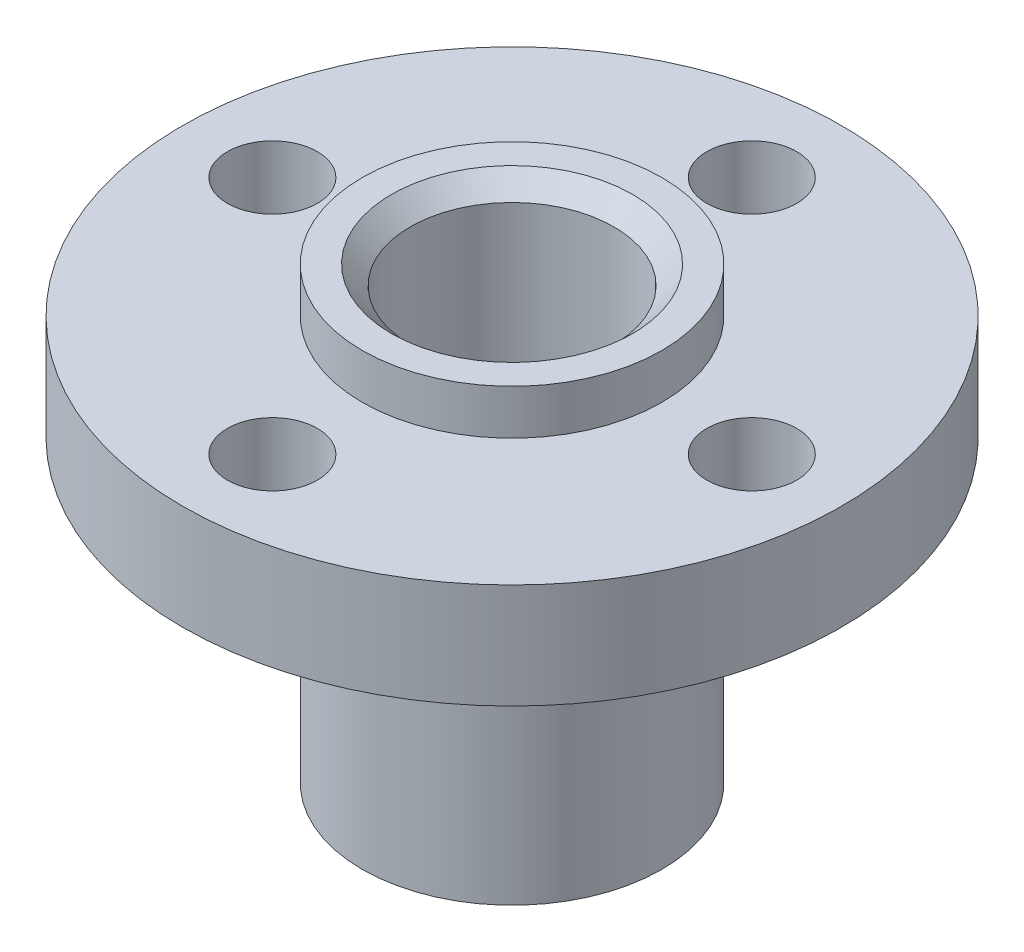
ISO-10303-21;
HEADER;
FILE_DESCRIPTION(('STEP AP214'),'2;1');
FILE_NAME('part.step','',(''),(''),'','','');
FILE_SCHEMA(('AUTOMOTIVE_DESIGN { 1 0 10303 214 1 1 1 1 }'));
ENDSEC;
DATA;
#1=APPLICATION_CONTEXT('core data for automotive mechanical design processes');
#2=APPLICATION_PROTOCOL_DEFINITION('international standard','automotive_design',2000,#1);
#3=PRODUCT_CONTEXT('',#1,'mechanical');
#4=PRODUCT('Part','Part','',(#3));
#5=PRODUCT_RELATED_PRODUCT_CATEGORY('part','',(#4));
#6=PRODUCT_DEFINITION_FORMATION('','',#4);
#7=PRODUCT_DEFINITION_CONTEXT('part definition',#1,'design');
#8=PRODUCT_DEFINITION('design','',#6,#7);
#9=PRODUCT_DEFINITION_SHAPE('','',#8);
#10=(LENGTH_UNIT() NAMED_UNIT(*) SI_UNIT(.MILLI.,.METRE.));
#11=(NAMED_UNIT(*) PLANE_ANGLE_UNIT() SI_UNIT($,.RADIAN.));
#12=(NAMED_UNIT(*) SI_UNIT($,.STERADIAN.) SOLID_ANGLE_UNIT());
#13=UNCERTAINTY_MEASURE_WITH_UNIT(LENGTH_MEASURE(1.E-05),#10,'distance_accuracy_value','');
#14=(GEOMETRIC_REPRESENTATION_CONTEXT(3) GLOBAL_UNCERTAINTY_ASSIGNED_CONTEXT((#13)) GLOBAL_UNIT_ASSIGNED_CONTEXT((#10,
#11,#12)) REPRESENTATION_CONTEXT('',''));
#15=CARTESIAN_POINT('',(0.,0.,0.));
#16=DIRECTION('',(0.,0.,1.));
#17=DIRECTION('',(1.,0.,0.));
#18=AXIS2_PLACEMENT_3D('',#15,#16,#17);
#19=CARTESIAN_POINT('',(0.,-10.,0.));
#20=DIRECTION('',(0.,1.,0.));
#21=DIRECTION('',(0.,0.,1.));
#22=AXIS2_PLACEMENT_3D('',#19,#20,#21);
#23=CYLINDRICAL_SURFACE('',#22,5.);
#24=CARTESIAN_POINT('',(0.,3.5,0.));
#25=DIRECTION('',(0.,1.,0.));
#26=DIRECTION('',(0.,0.,1.));
#27=AXIS2_PLACEMENT_3D('',#24,#25,#26);
#28=CIRCLE('',#27,5.);
#29=CARTESIAN_POINT('',(0.,3.5,5.));
#30=VERTEX_POINT('',#29);
#31=EDGE_CURVE('E10',#30,#30,#28,.F.);
#32=ORIENTED_EDGE('',*,*,#31,.F.);
#33=EDGE_LOOP('',(#32));
#34=FACE_BOUND('',#33,.T.);
#35=CARTESIAN_POINT('',(0.,5.,0.));
#36=DIRECTION('',(0.,1.,0.));
#37=DIRECTION('',(0.,0.,1.));
#38=AXIS2_PLACEMENT_3D('',#35,#36,#37);
#39=CIRCLE('',#38,5.);
#40=CARTESIAN_POINT('',(0.,5.,5.));
#41=VERTEX_POINT('',#40);
#42=EDGE_CURVE('E44',#41,#41,#39,.T.);
#43=ORIENTED_EDGE('',*,*,#42,.F.);
#44=EDGE_LOOP('',(#43));
#45=FACE_BOUND('',#44,.T.);
#46=ADVANCED_FACE('F33',(#34,#45),#23,.T.);
#47=CARTESIAN_POINT('',(0.,5.,0.));
#48=DIRECTION('',(0.,1.,0.));
#49=DIRECTION('',(0.,0.,1.));
#50=AXIS2_PLACEMENT_3D('',#47,#48,#49);
#51=PLANE('',#50);
#52=CARTESIAN_POINT('',(0.,5.,0.));
#53=DIRECTION('',(0.,1.,0.));
#54=DIRECTION('',(0.,0.,1.));
#55=AXIS2_PLACEMENT_3D('',#52,#53,#54);
#56=CIRCLE('',#55,4.025);
#57=CARTESIAN_POINT('',(0.,5.,4.025));
#58=VERTEX_POINT('',#57);
#59=EDGE_CURVE('E85',#58,#58,#56,.T.);
#60=ORIENTED_EDGE('',*,*,#59,.F.);
#61=EDGE_LOOP('',(#60));
#62=FACE_BOUND('',#61,.T.);
#63=ORIENTED_EDGE('',*,*,#42,.T.);
#64=EDGE_LOOP('',(#63));
#65=FACE_BOUND('',#64,.T.);
#66=ADVANCED_FACE('F91',(#62,#65),#51,.T.);
#67=CARTESIAN_POINT('',(0.,3.5,0.));
#68=DIRECTION('',(0.,1.,0.));
#69=DIRECTION('',(0.,0.,1.));
#70=AXIS2_PLACEMENT_3D('',#67,#68,#69);
#71=PLANE('',#70);
#72=ORIENTED_EDGE('',*,*,#31,.T.);
#73=EDGE_LOOP('',(#72));
#74=FACE_BOUND('',#73,.T.);
#75=CARTESIAN_POINT('',(-8.,3.5,0.));
#76=DIRECTION('',(0.,1.,0.));
#77=DIRECTION('',(0.,0.,1.));
#78=AXIS2_PLACEMENT_3D('',#75,#76,#77);
#79=CIRCLE('',#78,1.5);
#80=CARTESIAN_POINT('',(-8.,3.5,1.5));
#81=VERTEX_POINT('',#80);
#82=EDGE_CURVE('E68',#81,#81,#79,.T.);
#83=ORIENTED_EDGE('',*,*,#82,.F.);
#84=EDGE_LOOP('',(#83));
#85=FACE_BOUND('',#84,.T.);
#86=CARTESIAN_POINT('',(8.,3.5,0.));
#87=DIRECTION('',(0.,1.,0.));
#88=DIRECTION('',(0.,0.,1.));
#89=AXIS2_PLACEMENT_3D('',#86,#87,#88);
#90=CIRCLE('',#89,1.5);
#91=CARTESIAN_POINT('',(8.,3.5,1.5));
#92=VERTEX_POINT('',#91);
#93=EDGE_CURVE('E56',#92,#92,#90,.T.);
#94=ORIENTED_EDGE('',*,*,#93,.F.);
#95=EDGE_LOOP('',(#94));
#96=FACE_BOUND('',#95,.T.);
#97=CARTESIAN_POINT('',(0.,3.5,0.));
#98=DIRECTION('',(0.,1.,0.));
#99=DIRECTION('',(0.,0.,1.));
#100=AXIS2_PLACEMENT_3D('',#97,#98,#99);
#101=CIRCLE('',#100,11.);
#102=CARTESIAN_POINT('',(0.,3.5,11.));
#103=VERTEX_POINT('',#102);
#104=EDGE_CURVE('E49',#103,#103,#101,.T.);
#105=ORIENTED_EDGE('',*,*,#104,.T.);
#106=EDGE_LOOP('',(#105));
#107=FACE_BOUND('',#106,.T.);
#108=CARTESIAN_POINT('',(0.,3.5,-8.));
#109=DIRECTION('',(0.,1.,0.));
#110=DIRECTION('',(0.,0.,1.));
#111=AXIS2_PLACEMENT_3D('',#108,#109,#110);
#112=CIRCLE('',#111,1.5);
#113=CARTESIAN_POINT('',(0.,3.5,-6.5));
#114=VERTEX_POINT('',#113);
#115=EDGE_CURVE('E62',#114,#114,#112,.T.);
#116=ORIENTED_EDGE('',*,*,#115,.F.);
#117=EDGE_LOOP('',(#116));
#118=FACE_BOUND('',#117,.T.);
#119=CARTESIAN_POINT('',(0.,3.5,8.));
#120=DIRECTION('',(0.,1.,0.));
#121=DIRECTION('',(0.,0.,1.));
#122=AXIS2_PLACEMENT_3D('',#119,#120,#121);
#123=CIRCLE('',#122,1.5);
#124=CARTESIAN_POINT('',(0.,3.5,9.5));
#125=VERTEX_POINT('',#124);
#126=EDGE_CURVE('E74',#125,#125,#123,.T.);
#127=ORIENTED_EDGE('',*,*,#126,.F.);
#128=EDGE_LOOP('',(#127));
#129=FACE_BOUND('',#128,.T.);
#130=ADVANCED_FACE('F94',(#74,#85,#96,#107,#118,#129),#71,.T.);
#131=CARTESIAN_POINT('',(0.,0.,0.));
#132=DIRECTION('',(0.,1.,0.));
#133=DIRECTION('',(0.,0.,1.));
#134=AXIS2_PLACEMENT_3D('',#131,#132,#133);
#135=PLANE('',#134);
#136=CARTESIAN_POINT('',(0.,0.,0.));
#137=DIRECTION('',(0.,1.,0.));
#138=DIRECTION('',(0.,0.,1.));
#139=AXIS2_PLACEMENT_3D('',#136,#137,#138);
#140=CIRCLE('',#139,5.);
#141=CARTESIAN_POINT('',(0.,0.,5.));
#142=VERTEX_POINT('',#141);
#143=EDGE_CURVE('E47',#142,#142,#140,.F.);
#144=ORIENTED_EDGE('',*,*,#143,.F.);
#145=EDGE_LOOP('',(#144));
#146=FACE_BOUND('',#145,.T.);
#147=CARTESIAN_POINT('',(0.,0.,0.));
#148=DIRECTION('',(0.,1.,0.));
#149=DIRECTION('',(0.,0.,1.));
#150=AXIS2_PLACEMENT_3D('',#147,#148,#149);
#151=CIRCLE('',#150,11.);
#152=CARTESIAN_POINT('',(0.,0.,11.));
#153=VERTEX_POINT('',#152);
#154=EDGE_CURVE('E53',#153,#153,#151,.T.);
#155=ORIENTED_EDGE('',*,*,#154,.F.);
#156=EDGE_LOOP('',(#155));
#157=FACE_BOUND('',#156,.T.);
#158=CARTESIAN_POINT('',(8.,0.,0.));
#159=DIRECTION('',(0.,1.,0.));
#160=DIRECTION('',(0.,0.,1.));
#161=AXIS2_PLACEMENT_3D('',#158,#159,#160);
#162=CIRCLE('',#161,1.5);
#163=CARTESIAN_POINT('',(8.,0.,1.5));
#164=VERTEX_POINT('',#163);
#165=EDGE_CURVE('E59',#164,#164,#162,.T.);
#166=ORIENTED_EDGE('',*,*,#165,.T.);
#167=EDGE_LOOP('',(#166));
#168=FACE_BOUND('',#167,.T.);
#169=CARTESIAN_POINT('',(0.,0.,-8.));
#170=DIRECTION('',(0.,1.,0.));
#171=DIRECTION('',(0.,0.,1.));
#172=AXIS2_PLACEMENT_3D('',#169,#170,#171);
#173=CIRCLE('',#172,1.5);
#174=CARTESIAN_POINT('',(0.,0.,-6.5));
#175=VERTEX_POINT('',#174);
#176=EDGE_CURVE('E65',#175,#175,#173,.T.);
#177=ORIENTED_EDGE('',*,*,#176,.T.);
#178=EDGE_LOOP('',(#177));
#179=FACE_BOUND('',#178,.T.);
#180=CARTESIAN_POINT('',(-8.,0.,0.));
#181=DIRECTION('',(0.,1.,0.));
#182=DIRECTION('',(0.,0.,1.));
#183=AXIS2_PLACEMENT_3D('',#180,#181,#182);
#184=CIRCLE('',#183,1.5);
#185=CARTESIAN_POINT('',(-8.,0.,1.5));
#186=VERTEX_POINT('',#185);
#187=EDGE_CURVE('E71',#186,#186,#184,.T.);
#188=ORIENTED_EDGE('',*,*,#187,.T.);
#189=EDGE_LOOP('',(#188));
#190=FACE_BOUND('',#189,.T.);
#191=CARTESIAN_POINT('',(0.,0.,8.));
#192=DIRECTION('',(0.,1.,0.));
#193=DIRECTION('',(0.,0.,1.));
#194=AXIS2_PLACEMENT_3D('',#191,#192,#193);
#195=CIRCLE('',#194,1.5);
#196=CARTESIAN_POINT('',(0.,0.,9.5));
#197=VERTEX_POINT('',#196);
#198=EDGE_CURVE('E77',#197,#197,#195,.T.);
#199=ORIENTED_EDGE('',*,*,#198,.T.);
#200=EDGE_LOOP('',(#199));
#201=FACE_BOUND('',#200,.T.);
#202=ADVANCED_FACE('F119',(#146,#157,#168,#179,#190,#201),#135,.F.);
#203=CARTESIAN_POINT('',(0.,3.5,0.));
#204=DIRECTION('',(0.,-1.,0.));
#205=DIRECTION('',(0.,0.,-1.));
#206=AXIS2_PLACEMENT_3D('',#203,#204,#205);
#207=CYLINDRICAL_SURFACE('',#206,11.);
#208=ORIENTED_EDGE('',*,*,#104,.F.);
#209=EDGE_LOOP('',(#208));
#210=FACE_BOUND('',#209,.T.);
#211=ORIENTED_EDGE('',*,*,#154,.T.);
#212=EDGE_LOOP('',(#211));
#213=FACE_BOUND('',#212,.T.);
#214=ADVANCED_FACE('F122',(#210,#213),#207,.T.);
#215=CARTESIAN_POINT('',(8.,3.5,0.));
#216=DIRECTION('',(0.,-1.,0.));
#217=DIRECTION('',(0.,0.,-1.));
#218=AXIS2_PLACEMENT_3D('',#215,#216,#217);
#219=CYLINDRICAL_SURFACE('',#218,1.5);
#220=ORIENTED_EDGE('',*,*,#93,.T.);
#221=EDGE_LOOP('',(#220));
#222=FACE_BOUND('',#221,.T.);
#223=ORIENTED_EDGE('',*,*,#165,.F.);
#224=EDGE_LOOP('',(#223));
#225=FACE_BOUND('',#224,.T.);
#226=ADVANCED_FACE('F148',(#222,#225),#219,.F.);
#227=CARTESIAN_POINT('',(0.,3.5,-8.));
#228=DIRECTION('',(0.,-1.,0.));
#229=DIRECTION('',(0.,0.,-1.));
#230=AXIS2_PLACEMENT_3D('',#227,#228,#229);
#231=CYLINDRICAL_SURFACE('',#230,1.5);
#232=ORIENTED_EDGE('',*,*,#115,.T.);
#233=EDGE_LOOP('',(#232));
#234=FACE_BOUND('',#233,.T.);
#235=ORIENTED_EDGE('',*,*,#176,.F.);
#236=EDGE_LOOP('',(#235));
#237=FACE_BOUND('',#236,.T.);
#238=ADVANCED_FACE('F141',(#234,#237),#231,.F.);
#239=CARTESIAN_POINT('',(-8.,3.5,0.));
#240=DIRECTION('',(0.,-1.,0.));
#241=DIRECTION('',(0.,0.,-1.));
#242=AXIS2_PLACEMENT_3D('',#239,#240,#241);
#243=CYLINDRICAL_SURFACE('',#242,1.5);
#244=ORIENTED_EDGE('',*,*,#82,.T.);
#245=EDGE_LOOP('',(#244));
#246=FACE_BOUND('',#245,.T.);
#247=ORIENTED_EDGE('',*,*,#187,.F.);
#248=EDGE_LOOP('',(#247));
#249=FACE_BOUND('',#248,.T.);
#250=ADVANCED_FACE('F135',(#246,#249),#243,.F.);
#251=CARTESIAN_POINT('',(0.,3.5,8.));
#252=DIRECTION('',(0.,-1.,0.));
#253=DIRECTION('',(0.,0.,-1.));
#254=AXIS2_PLACEMENT_3D('',#251,#252,#253);
#255=CYLINDRICAL_SURFACE('',#254,1.5);
#256=ORIENTED_EDGE('',*,*,#126,.T.);
#257=EDGE_LOOP('',(#256));
#258=FACE_BOUND('',#257,.T.);
#259=ORIENTED_EDGE('',*,*,#198,.F.);
#260=EDGE_LOOP('',(#259));
#261=FACE_BOUND('',#260,.T.);
#262=ADVANCED_FACE('F113',(#258,#261),#255,.F.);
#263=CARTESIAN_POINT('',(0.,-10.,0.));
#264=DIRECTION('',(0.,1.,0.));
#265=DIRECTION('',(0.,0.,1.));
#266=AXIS2_PLACEMENT_3D('',#263,#264,#265);
#267=PLANE('',#266);
#268=CARTESIAN_POINT('',(0.,-10.,0.));
#269=DIRECTION('',(0.,1.,0.));
#270=DIRECTION('',(0.,0.,1.));
#271=AXIS2_PLACEMENT_3D('',#268,#269,#270);
#272=CIRCLE('',#271,3.4);
#273=CARTESIAN_POINT('',(0.,-10.,3.4));
#274=VERTEX_POINT('',#273);
#275=EDGE_CURVE('E36',#274,#274,#272,.T.);
#276=ORIENTED_EDGE('',*,*,#275,.T.);
#277=EDGE_LOOP('',(#276));
#278=FACE_BOUND('',#277,.T.);
#279=CARTESIAN_POINT('',(0.,-10.,0.));
#280=DIRECTION('',(0.,1.,0.));
#281=DIRECTION('',(0.,0.,1.));
#282=AXIS2_PLACEMENT_3D('',#279,#280,#281);
#283=CIRCLE('',#282,5.);
#284=CARTESIAN_POINT('',(0.,-10.,5.));
#285=VERTEX_POINT('',#284);
#286=EDGE_CURVE('E40',#285,#285,#283,.T.);
#287=ORIENTED_EDGE('',*,*,#286,.F.);
#288=EDGE_LOOP('',(#287));
#289=FACE_BOUND('',#288,.T.);
#290=ADVANCED_FACE('F105',(#278,#289),#267,.F.);
#291=ORIENTED_EDGE('',*,*,#286,.T.);
#292=EDGE_LOOP('',(#291));
#293=FACE_BOUND('',#292,.T.);
#294=ORIENTED_EDGE('',*,*,#143,.T.);
#295=EDGE_LOOP('',(#294));
#296=FACE_BOUND('',#295,.T.);
#297=ADVANCED_FACE('F100',(#293,#296),#23,.T.);
#298=CARTESIAN_POINT('',(0.,5.,0.));
#299=DIRECTION('',(0.,1.,0.));
#300=DIRECTION('',(0.,0.,1.));
#301=AXIS2_PLACEMENT_3D('',#298,#299,#300);
#302=CYLINDRICAL_SURFACE('',#301,3.4);
#303=CARTESIAN_POINT('',(0.,4.375,0.));
#304=DIRECTION('',(0.,1.,0.));
#305=DIRECTION('',(0.,0.,1.));
#306=AXIS2_PLACEMENT_3D('',#303,#304,#305);
#307=CIRCLE('',#306,3.4);
#308=CARTESIAN_POINT('',(0.,4.375,3.4));
#309=VERTEX_POINT('',#308);
#310=EDGE_CURVE('E82',#309,#309,#307,.T.);
#311=ORIENTED_EDGE('',*,*,#310,.T.);
#312=EDGE_LOOP('',(#311));
#313=FACE_BOUND('',#312,.T.);
#314=ORIENTED_EDGE('',*,*,#275,.F.);
#315=EDGE_LOOP('',(#314));
#316=FACE_BOUND('',#315,.T.);
#317=ADVANCED_FACE('F104',(#313,#316),#302,.F.);
#318=CARTESIAN_POINT('',(0.,5.,0.));
#319=DIRECTION('',(0.,1.,0.));
#320=DIRECTION('',(0.,0.,1.));
#321=AXIS2_PLACEMENT_3D('',#318,#319,#320);
#322=CONICAL_SURFACE('',#321,4.025,0.785398163397448);
#323=ORIENTED_EDGE('',*,*,#310,.F.);
#324=EDGE_LOOP('',(#323));
#325=FACE_BOUND('',#324,.T.);
#326=ORIENTED_EDGE('',*,*,#59,.T.);
#327=EDGE_LOOP('',(#326));
#328=FACE_BOUND('',#327,.T.);
#329=ADVANCED_FACE('F89',(#325,#328),#322,.F.);
#330=CLOSED_SHELL('',(#46,#66,#130,#202,#214,#226,#238,#250,#262,#290,#297,#317,#329));
#331=MANIFOLD_SOLID_BREP('B2',#330);
#332=ADVANCED_BREP_SHAPE_REPRESENTATION('',(#18,#331),#14);
#333=SHAPE_DEFINITION_REPRESENTATION(#9,#332);
ENDSEC;
END-ISO-10303-21;
